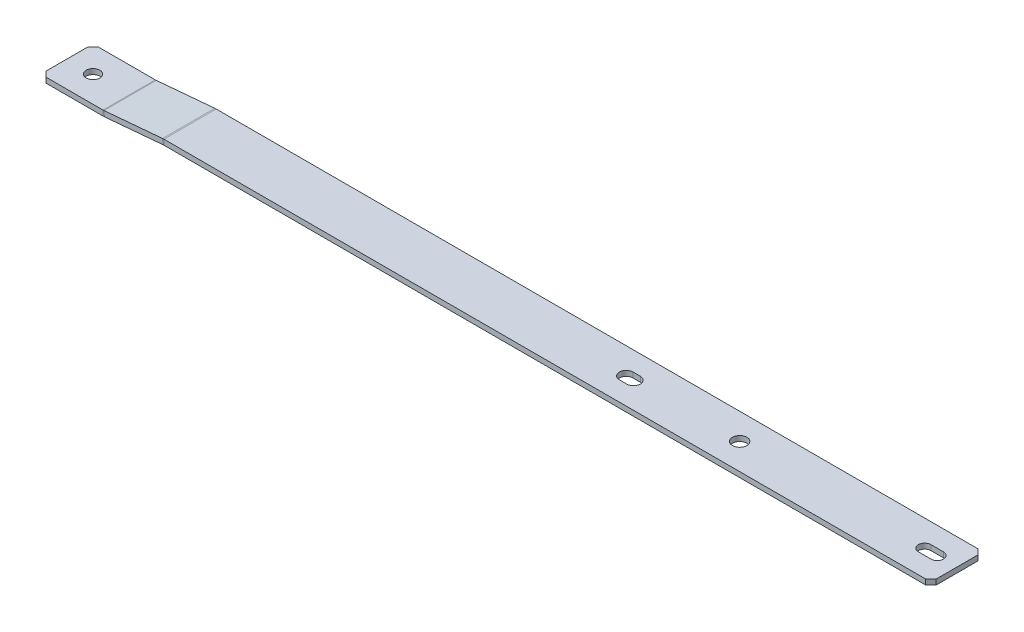
ISO-10303-21;
HEADER;
FILE_DESCRIPTION(('STEP AP214'),'2;1');
FILE_NAME('part.step','',(''),(''),'','','');
FILE_SCHEMA(('AUTOMOTIVE_DESIGN { 1 0 10303 214 1 1 1 1 }'));
ENDSEC;
DATA;
#1=APPLICATION_CONTEXT('core data for automotive mechanical design processes');
#2=APPLICATION_PROTOCOL_DEFINITION('international standard','automotive_design',2000,#1);
#3=PRODUCT_CONTEXT('',#1,'mechanical');
#4=PRODUCT('Part','Part','',(#3));
#5=PRODUCT_RELATED_PRODUCT_CATEGORY('part','',(#4));
#6=PRODUCT_DEFINITION_FORMATION('','',#4);
#7=PRODUCT_DEFINITION_CONTEXT('part definition',#1,'design');
#8=PRODUCT_DEFINITION('design','',#6,#7);
#9=PRODUCT_DEFINITION_SHAPE('','',#8);
#10=(LENGTH_UNIT() NAMED_UNIT(*) SI_UNIT(.MILLI.,.METRE.));
#11=(NAMED_UNIT(*) PLANE_ANGLE_UNIT() SI_UNIT($,.RADIAN.));
#12=(NAMED_UNIT(*) SI_UNIT($,.STERADIAN.) SOLID_ANGLE_UNIT());
#13=UNCERTAINTY_MEASURE_WITH_UNIT(LENGTH_MEASURE(1.E-05),#10,'distance_accuracy_value','');
#14=(GEOMETRIC_REPRESENTATION_CONTEXT(3) GLOBAL_UNCERTAINTY_ASSIGNED_CONTEXT((#13)) GLOBAL_UNIT_ASSIGNED_CONTEXT((#10,
#11,#12)) REPRESENTATION_CONTEXT('',''));
#15=CARTESIAN_POINT('',(0.,0.,0.));
#16=DIRECTION('',(0.,0.,1.));
#17=DIRECTION('',(1.,0.,0.));
#18=AXIS2_PLACEMENT_3D('',#15,#16,#17);
#19=CARTESIAN_POINT('',(-733.694824342566,0.,50.));
#20=DIRECTION('',(0.,0.,1.));
#21=DIRECTION('',(1.,0.,0.));
#22=AXIS2_PLACEMENT_3D('',#19,#20,#21);
#23=PLANE('',#22);
#24=DIRECTION('',(0.,-1.,0.));
#25=VECTOR('',#24,1.);
#26=CARTESIAN_POINT('',(-733.694824342566,0.,50.));
#27=LINE('',#26,#25);
#28=CARTESIAN_POINT('',(-733.694824342566,0.,50.));
#29=VERTEX_POINT('',#28);
#30=CARTESIAN_POINT('',(-733.694824342566,-5.,50.));
#31=VERTEX_POINT('',#30);
#32=EDGE_CURVE('E388',#29,#31,#27,.T.);
#33=ORIENTED_EDGE('',*,*,#32,.F.);
#34=CARTESIAN_POINT('',(-733.694824342566,-15.,50.));
#35=DIRECTION('',(0.,0.,-1.));
#36=DIRECTION('',(-1.,0.,0.));
#37=AXIS2_PLACEMENT_3D('',#34,#35,#36);
#38=CIRCLE('',#37,15.);
#39=CARTESIAN_POINT('',(-735.002160483781,-0.0570795286238173,50.));
#40=VERTEX_POINT('',#39);
#41=EDGE_CURVE('E292',#40,#29,#38,.T.);
#42=ORIENTED_EDGE('',*,*,#41,.F.);
#43=DIRECTION('',(-0.0871557427476687,0.996194698091745,0.));
#44=VECTOR('',#43,1.);
#45=CARTESIAN_POINT('',(-734.566381770042,-5.03805301908255,50.));
#46=LINE('',#45,#44);
#47=CARTESIAN_POINT('',(-734.566381770042,-5.03805301908255,50.));
#48=VERTEX_POINT('',#47);
#49=EDGE_CURVE('E386',#48,#40,#46,.T.);
#50=ORIENTED_EDGE('',*,*,#49,.F.);
#51=CARTESIAN_POINT('',(-733.694824342566,-15.,50.));
#52=DIRECTION('',(0.,0.,1.));
#53=DIRECTION('',(1.,0.,0.));
#54=AXIS2_PLACEMENT_3D('',#51,#52,#53);
#55=CIRCLE('',#54,10.);
#56=EDGE_CURVE('E311',#48,#31,#55,.F.);
#57=ORIENTED_EDGE('',*,*,#56,.T.);
#58=EDGE_LOOP('',(#33,#42,#50,#57));
#59=FACE_BOUND('',#58,.T.);
#60=ADVANCED_FACE('F45',(#59),#23,.T.);
#61=CARTESIAN_POINT('',(-734.566381770042,-5.03805301908255,50.));
#62=DIRECTION('',(0.,0.,1.));
#63=DIRECTION('',(1.,0.,0.));
#64=AXIS2_PLACEMENT_3D('',#61,#62,#63);
#65=PLANE('',#64);
#66=DIRECTION('',(1.,0.,0.));
#67=VECTOR('',#66,1.);
#68=CARTESIAN_POINT('',(-734.349738486193,-5.,50.));
#69=LINE('',#68,#67);
#70=CARTESIAN_POINT('',(-5.,-5.,50.));
#71=VERTEX_POINT('',#70);
#72=EDGE_CURVE('E285',#31,#71,#69,.T.);
#73=ORIENTED_EDGE('',*,*,#72,.T.);
#74=DIRECTION('',(0.,1.,0.));
#75=VECTOR('',#74,1.);
#76=CARTESIAN_POINT('',(-5.,-5.03805301908255,50.));
#77=LINE('',#76,#75);
#78=CARTESIAN_POINT('',(-5.,0.,50.));
#79=VERTEX_POINT('',#78);
#80=EDGE_CURVE('E408',#71,#79,#77,.T.);
#81=ORIENTED_EDGE('',*,*,#80,.T.);
#82=DIRECTION('',(1.,0.,0.));
#83=VECTOR('',#82,1.);
#84=CARTESIAN_POINT('',(-734.349738486193,0.,50.));
#85=LINE('',#84,#83);
#86=EDGE_CURVE('E288',#29,#79,#85,.T.);
#87=ORIENTED_EDGE('',*,*,#86,.F.);
#88=ORIENTED_EDGE('',*,*,#32,.T.);
#89=EDGE_LOOP('',(#73,#81,#87,#88));
#90=FACE_BOUND('',#89,.T.);
#91=ADVANCED_FACE('F508',(#90),#65,.T.);
#92=CARTESIAN_POINT('',(-735.002160483781,-0.0570795286238173,0.));
#93=DIRECTION('',(0.,0.,-1.));
#94=DIRECTION('',(-1.,0.,0.));
#95=AXIS2_PLACEMENT_3D('',#92,#93,#94);
#96=PLANE('',#95);
#97=DIRECTION('',(0.0871557427476687,-0.996194698091745,0.));
#98=VECTOR('',#97,1.);
#99=CARTESIAN_POINT('',(-735.002160483781,-0.0570795286238173,0.));
#100=LINE('',#99,#98);
#101=CARTESIAN_POINT('',(-735.002160483781,-0.0570795286238173,0.));
#102=VERTEX_POINT('',#101);
#103=CARTESIAN_POINT('',(-734.566381770042,-5.03805301908255,0.));
#104=VERTEX_POINT('',#103);
#105=EDGE_CURVE('E384',#102,#104,#100,.T.);
#106=ORIENTED_EDGE('',*,*,#105,.F.);
#107=CARTESIAN_POINT('',(-733.694824342566,-15.,0.));
#108=DIRECTION('',(0.,0.,-1.));
#109=DIRECTION('',(-1.,0.,0.));
#110=AXIS2_PLACEMENT_3D('',#107,#108,#109);
#111=CIRCLE('',#110,15.);
#112=CARTESIAN_POINT('',(-733.694824342566,0.,0.));
#113=VERTEX_POINT('',#112);
#114=EDGE_CURVE('E320',#102,#113,#111,.T.);
#115=ORIENTED_EDGE('',*,*,#114,.T.);
#116=DIRECTION('',(0.,1.,0.));
#117=VECTOR('',#116,1.);
#118=CARTESIAN_POINT('',(-733.694824342566,-5.,0.));
#119=LINE('',#118,#117);
#120=CARTESIAN_POINT('',(-733.694824342566,-5.,0.));
#121=VERTEX_POINT('',#120);
#122=EDGE_CURVE('E382',#121,#113,#119,.T.);
#123=ORIENTED_EDGE('',*,*,#122,.F.);
#124=CARTESIAN_POINT('',(-733.694824342566,-15.,0.));
#125=DIRECTION('',(0.,0.,1.));
#126=DIRECTION('',(1.,0.,0.));
#127=AXIS2_PLACEMENT_3D('',#124,#125,#126);
#128=CIRCLE('',#127,10.);
#129=EDGE_CURVE('E289',#104,#121,#128,.F.);
#130=ORIENTED_EDGE('',*,*,#129,.F.);
#131=EDGE_LOOP('',(#106,#115,#123,#130));
#132=FACE_BOUND('',#131,.T.);
#133=ADVANCED_FACE('F483',(#132),#96,.T.);
#134=CARTESIAN_POINT('',(-733.694824342566,-5.,0.));
#135=DIRECTION('',(0.,0.,-1.));
#136=DIRECTION('',(-1.,0.,0.));
#137=AXIS2_PLACEMENT_3D('',#134,#135,#136);
#138=PLANE('',#137);
#139=DIRECTION('',(0.996194698091746,0.0871557427476584,0.));
#140=VECTOR('',#139,1.);
#141=CARTESIAN_POINT('',(-734.349738486193,0.,0.));
#142=LINE('',#141,#140);
#143=CARTESIAN_POINT('',(-791.065052001608,-4.96194698091745,0.));
#144=VERTEX_POINT('',#143);
#145=EDGE_CURVE('E323',#144,#102,#142,.T.);
#146=ORIENTED_EDGE('',*,*,#145,.T.);
#147=ORIENTED_EDGE('',*,*,#105,.T.);
#148=DIRECTION('',(0.996194698091746,0.0871557427476584,0.));
#149=VECTOR('',#148,1.);
#150=CARTESIAN_POINT('',(-733.913959772455,-4.98097349045873,0.));
#151=LINE('',#150,#149);
#152=CARTESIAN_POINT('',(-790.62927328787,-9.94292047137618,0.));
#153=VERTEX_POINT('',#152);
#154=EDGE_CURVE('E336',#153,#104,#151,.T.);
#155=ORIENTED_EDGE('',*,*,#154,.F.);
#156=DIRECTION('',(-0.0871557427476687,0.996194698091745,0.));
#157=VECTOR('',#156,1.);
#158=CARTESIAN_POINT('',(-790.62927328787,-9.94292047137618,0.));
#159=LINE('',#158,#157);
#160=EDGE_CURVE('E372',#153,#144,#159,.T.);
#161=ORIENTED_EDGE('',*,*,#160,.T.);
#162=EDGE_LOOP('',(#146,#147,#155,#161));
#163=FACE_BOUND('',#162,.T.);
#164=ADVANCED_FACE('F465',(#163),#138,.T.);
#165=CARTESIAN_POINT('',(-791.065052001608,-4.96194698091745,50.));
#166=DIRECTION('',(0.,0.,1.));
#167=DIRECTION('',(1.,0.,0.));
#168=AXIS2_PLACEMENT_3D('',#165,#166,#167);
#169=PLANE('',#168);
#170=DIRECTION('',(0.0871557427476687,-0.996194698091745,0.));
#171=VECTOR('',#170,1.);
#172=CARTESIAN_POINT('',(-791.065052001608,-4.96194698091745,50.));
#173=LINE('',#172,#171);
#174=CARTESIAN_POINT('',(-791.065052001608,-4.96194698091745,50.));
#175=VERTEX_POINT('',#174);
#176=CARTESIAN_POINT('',(-790.62927328787,-9.94292047137618,50.));
#177=VERTEX_POINT('',#176);
#178=EDGE_CURVE('E380',#175,#177,#173,.T.);
#179=ORIENTED_EDGE('',*,*,#178,.F.);
#180=CARTESIAN_POINT('',(-791.936609429085,5.,50.));
#181=DIRECTION('',(0.,0.,1.));
#182=DIRECTION('',(1.,0.,0.));
#183=AXIS2_PLACEMENT_3D('',#180,#181,#182);
#184=CIRCLE('',#183,10.);
#185=CARTESIAN_POINT('',(-791.936609429085,-5.00000000000001,50.));
#186=VERTEX_POINT('',#185);
#187=EDGE_CURVE('E298',#186,#175,#184,.T.);
#188=ORIENTED_EDGE('',*,*,#187,.F.);
#189=DIRECTION('',(0.,1.,0.));
#190=VECTOR('',#189,1.);
#191=CARTESIAN_POINT('',(-791.936609429085,-10.,50.));
#192=LINE('',#191,#190);
#193=CARTESIAN_POINT('',(-791.936609429085,-10.,50.));
#194=VERTEX_POINT('',#193);
#195=EDGE_CURVE('E377',#194,#186,#192,.T.);
#196=ORIENTED_EDGE('',*,*,#195,.F.);
#197=CARTESIAN_POINT('',(-791.936609429085,5.,50.));
#198=DIRECTION('',(0.,0.,1.));
#199=DIRECTION('',(1.,0.,0.));
#200=AXIS2_PLACEMENT_3D('',#197,#198,#199);
#201=CIRCLE('',#200,15.);
#202=EDGE_CURVE('E305',#194,#177,#201,.T.);
#203=ORIENTED_EDGE('',*,*,#202,.T.);
#204=EDGE_LOOP('',(#179,#188,#196,#203));
#205=FACE_BOUND('',#204,.T.);
#206=ADVANCED_FACE('F498',(#205),#169,.T.);
#207=CARTESIAN_POINT('',(-791.936609429085,-10.,50.));
#208=DIRECTION('',(0.,0.,1.));
#209=DIRECTION('',(1.,0.,0.));
#210=AXIS2_PLACEMENT_3D('',#207,#208,#209);
#211=PLANE('',#210);
#212=DIRECTION('',(0.996194698091746,0.0871557427476584,0.));
#213=VECTOR('',#212,1.);
#214=CARTESIAN_POINT('',(-734.349738486193,0.,50.));
#215=LINE('',#214,#213);
#216=EDGE_CURVE('E295',#175,#40,#215,.T.);
#217=ORIENTED_EDGE('',*,*,#216,.F.);
#218=ORIENTED_EDGE('',*,*,#178,.T.);
#219=DIRECTION('',(0.996194698091746,0.0871557427476584,0.));
#220=VECTOR('',#219,1.);
#221=CARTESIAN_POINT('',(-733.913959772455,-4.98097349045873,50.));
#222=LINE('',#221,#220);
#223=EDGE_CURVE('E308',#177,#48,#222,.T.);
#224=ORIENTED_EDGE('',*,*,#223,.T.);
#225=ORIENTED_EDGE('',*,*,#49,.T.);
#226=EDGE_LOOP('',(#217,#218,#224,#225));
#227=FACE_BOUND('',#226,.T.);
#228=ADVANCED_FACE('F496',(#227),#211,.T.);
#229=CARTESIAN_POINT('',(-791.936609429085,-5.00000000000001,0.));
#230=DIRECTION('',(0.,0.,-1.));
#231=DIRECTION('',(-1.,0.,0.));
#232=AXIS2_PLACEMENT_3D('',#229,#230,#231);
#233=PLANE('',#232);
#234=DIRECTION('',(0.,-1.,0.));
#235=VECTOR('',#234,1.);
#236=CARTESIAN_POINT('',(-791.936609429085,-5.00000000000001,0.));
#237=LINE('',#236,#235);
#238=CARTESIAN_POINT('',(-791.936609429085,-5.00000000000001,0.));
#239=VERTEX_POINT('',#238);
#240=CARTESIAN_POINT('',(-791.936609429085,-10.,0.));
#241=VERTEX_POINT('',#240);
#242=EDGE_CURVE('E374',#239,#241,#237,.T.);
#243=ORIENTED_EDGE('',*,*,#242,.F.);
#244=CARTESIAN_POINT('',(-791.936609429085,5.,0.));
#245=DIRECTION('',(0.,0.,1.));
#246=DIRECTION('',(1.,0.,0.));
#247=AXIS2_PLACEMENT_3D('',#244,#245,#246);
#248=CIRCLE('',#247,10.);
#249=EDGE_CURVE('E326',#239,#144,#248,.T.);
#250=ORIENTED_EDGE('',*,*,#249,.T.);
#251=ORIENTED_EDGE('',*,*,#160,.F.);
#252=CARTESIAN_POINT('',(-791.936609429085,5.,0.));
#253=DIRECTION('',(0.,0.,1.));
#254=DIRECTION('',(1.,0.,0.));
#255=AXIS2_PLACEMENT_3D('',#252,#253,#254);
#256=CIRCLE('',#255,15.);
#257=EDGE_CURVE('E333',#241,#153,#256,.T.);
#258=ORIENTED_EDGE('',*,*,#257,.F.);
#259=EDGE_LOOP('',(#243,#250,#251,#258));
#260=FACE_BOUND('',#259,.T.);
#261=ADVANCED_FACE('F461',(#260),#233,.T.);
#262=CARTESIAN_POINT('',(-790.62927328787,-9.94292047137618,0.));
#263=DIRECTION('',(0.,0.,-1.));
#264=DIRECTION('',(-1.,0.,0.));
#265=AXIS2_PLACEMENT_3D('',#262,#263,#264);
#266=PLANE('',#265);
#267=DIRECTION('',(1.,0.,0.));
#268=VECTOR('',#267,1.);
#269=CARTESIAN_POINT('',(-791.5,-10.,0.));
#270=LINE('',#269,#268);
#271=CARTESIAN_POINT('',(-846.5,-10.,0.));
#272=VERTEX_POINT('',#271);
#273=EDGE_CURVE('E331',#272,#241,#270,.T.);
#274=ORIENTED_EDGE('',*,*,#273,.F.);
#275=DIRECTION('',(0.,1.,0.));
#276=VECTOR('',#275,1.);
#277=CARTESIAN_POINT('',(-846.5,-9.94292047137618,0.));
#278=LINE('',#277,#276);
#279=CARTESIAN_POINT('',(-846.5,-5.00000000000001,0.));
#280=VERTEX_POINT('',#279);
#281=EDGE_CURVE('E412',#272,#280,#278,.T.);
#282=ORIENTED_EDGE('',*,*,#281,.T.);
#283=DIRECTION('',(1.,0.,0.));
#284=VECTOR('',#283,1.);
#285=CARTESIAN_POINT('',(-791.5,-5.00000000000001,0.));
#286=LINE('',#285,#284);
#287=EDGE_CURVE('E329',#280,#239,#286,.T.);
#288=ORIENTED_EDGE('',*,*,#287,.T.);
#289=ORIENTED_EDGE('',*,*,#242,.T.);
#290=EDGE_LOOP('',(#274,#282,#288,#289));
#291=FACE_BOUND('',#290,.T.);
#292=ADVANCED_FACE('F454',(#291),#266,.T.);
#293=CARTESIAN_POINT('',(-734.349738486193,-5.,50.));
#294=DIRECTION('',(0.,1.,0.));
#295=DIRECTION('',(0.,0.,1.));
#296=AXIS2_PLACEMENT_3D('',#293,#294,#295);
#297=PLANE('',#296);
#298=DIRECTION('',(1.,0.,0.));
#299=VECTOR('',#298,1.);
#300=CARTESIAN_POINT('',(-734.349738486193,-5.,30.9999999999995));
#301=LINE('',#300,#299);
#302=CARTESIAN_POINT('',(-31.,-5.,30.9999999999999));
#303=VERTEX_POINT('',#302);
#304=CARTESIAN_POINT('',(-19.,-5.,30.9999999999999));
#305=VERTEX_POINT('',#304);
#306=EDGE_CURVE('E236',#303,#305,#301,.T.);
#307=ORIENTED_EDGE('',*,*,#306,.T.);
#308=CARTESIAN_POINT('',(-19.,-5.,24.9999999999999));
#309=DIRECTION('',(0.,1.,0.));
#310=DIRECTION('',(0.,0.,1.));
#311=AXIS2_PLACEMENT_3D('',#308,#309,#310);
#312=CIRCLE('',#311,6.00000000000001);
#313=CARTESIAN_POINT('',(-19.,-5.,18.9999999999999));
#314=VERTEX_POINT('',#313);
#315=EDGE_CURVE('E239',#305,#314,#312,.T.);
#316=ORIENTED_EDGE('',*,*,#315,.T.);
#317=DIRECTION('',(-1.,0.,0.));
#318=VECTOR('',#317,1.);
#319=CARTESIAN_POINT('',(-734.349738486193,-5.,18.9999999999999));
#320=LINE('',#319,#318);
#321=CARTESIAN_POINT('',(-30.9999999999999,-5.,18.9999999999999));
#322=VERTEX_POINT('',#321);
#323=EDGE_CURVE('E231',#314,#322,#320,.T.);
#324=ORIENTED_EDGE('',*,*,#323,.T.);
#325=CARTESIAN_POINT('',(-31.,-5.,24.9999999999999));
#326=DIRECTION('',(0.,1.,0.));
#327=DIRECTION('',(0.,0.,1.));
#328=AXIS2_PLACEMENT_3D('',#325,#326,#327);
#329=CIRCLE('',#328,6.);
#330=EDGE_CURVE('E211',#322,#303,#329,.T.);
#331=ORIENTED_EDGE('',*,*,#330,.T.);
#332=EDGE_LOOP('',(#307,#316,#324,#331));
#333=FACE_BOUND('',#332,.T.);
#334=CARTESIAN_POINT('',(-208.,-5.,25.));
#335=DIRECTION('',(0.,1.,0.));
#336=DIRECTION('',(0.,0.,1.));
#337=AXIS2_PLACEMENT_3D('',#334,#335,#336);
#338=CIRCLE('',#337,6.89999999999999);
#339=CARTESIAN_POINT('',(-208.,-5.,31.9));
#340=VERTEX_POINT('',#339);
#341=EDGE_CURVE('E281',#340,#340,#338,.T.);
#342=ORIENTED_EDGE('',*,*,#341,.T.);
#343=EDGE_LOOP('',(#342));
#344=FACE_BOUND('',#343,.T.);
#345=DIRECTION('',(1.,0.,0.));
#346=VECTOR('',#345,1.);
#347=CARTESIAN_POINT('',(-734.349738486193,-5.,31.5));
#348=LINE('',#347,#346);
#349=CARTESIAN_POINT('',(-316.5,-5.,31.5));
#350=VERTEX_POINT('',#349);
#351=CARTESIAN_POINT('',(-309.5,-5.,31.5));
#352=VERTEX_POINT('',#351);
#353=EDGE_CURVE('E275',#350,#352,#348,.T.);
#354=ORIENTED_EDGE('',*,*,#353,.T.);
#355=CARTESIAN_POINT('',(-309.5,-5.,25.));
#356=DIRECTION('',(0.,1.,0.));
#357=DIRECTION('',(0.,0.,1.));
#358=AXIS2_PLACEMENT_3D('',#355,#356,#357);
#359=CIRCLE('',#358,6.5);
#360=CARTESIAN_POINT('',(-309.5,-5.,18.5));
#361=VERTEX_POINT('',#360);
#362=EDGE_CURVE('E278',#352,#361,#359,.T.);
#363=ORIENTED_EDGE('',*,*,#362,.T.);
#364=DIRECTION('',(-1.,0.,0.));
#365=VECTOR('',#364,1.);
#366=CARTESIAN_POINT('',(-734.349738486193,-5.,18.5000000000002));
#367=LINE('',#366,#365);
#368=CARTESIAN_POINT('',(-316.5,-5.,18.5));
#369=VERTEX_POINT('',#368);
#370=EDGE_CURVE('E249',#361,#369,#367,.T.);
#371=ORIENTED_EDGE('',*,*,#370,.T.);
#372=CARTESIAN_POINT('',(-316.5,-5.,25.));
#373=DIRECTION('',(0.,1.,0.));
#374=DIRECTION('',(0.,0.,1.));
#375=AXIS2_PLACEMENT_3D('',#372,#373,#374);
#376=CIRCLE('',#375,6.5);
#377=EDGE_CURVE('E272',#369,#350,#376,.T.);
#378=ORIENTED_EDGE('',*,*,#377,.T.);
#379=EDGE_LOOP('',(#354,#363,#371,#378));
#380=FACE_BOUND('',#379,.T.);
#381=DIRECTION('',(0.,0.,-1.));
#382=VECTOR('',#381,1.);
#383=CARTESIAN_POINT('',(0.,-5.,50.));
#384=LINE('',#383,#382);
#385=CARTESIAN_POINT('',(0.,-5.,45.));
#386=VERTEX_POINT('',#385);
#387=CARTESIAN_POINT('',(0.,-5.,5.));
#388=VERTEX_POINT('',#387);
#389=EDGE_CURVE('E370',#386,#388,#384,.T.);
#390=ORIENTED_EDGE('',*,*,#389,.F.);
#391=DIRECTION('',(0.707106781186548,0.,-0.707106781186547));
#392=VECTOR('',#391,1.);
#393=CARTESIAN_POINT('',(0.,-5.,45.));
#394=LINE('',#393,#392);
#395=EDGE_CURVE('E406',#386,#71,#394,.F.);
#396=ORIENTED_EDGE('',*,*,#395,.T.);
#397=ORIENTED_EDGE('',*,*,#72,.F.);
#398=DIRECTION('',(0.,0.,-1.));
#399=VECTOR('',#398,1.);
#400=CARTESIAN_POINT('',(-733.694824342566,-5.,50.));
#401=LINE('',#400,#399);
#402=EDGE_CURVE('E314',#31,#121,#401,.T.);
#403=ORIENTED_EDGE('',*,*,#402,.T.);
#404=DIRECTION('',(1.,0.,0.));
#405=VECTOR('',#404,1.);
#406=CARTESIAN_POINT('',(-734.349738486193,-5.,0.));
#407=LINE('',#406,#405);
#408=CARTESIAN_POINT('',(-5.,-5.,0.));
#409=VERTEX_POINT('',#408);
#410=EDGE_CURVE('E284',#121,#409,#407,.T.);
#411=ORIENTED_EDGE('',*,*,#410,.T.);
#412=DIRECTION('',(-0.707106781186548,0.,-0.707106781186547));
#413=VECTOR('',#412,1.);
#414=CARTESIAN_POINT('',(-5.,-5.,0.));
#415=LINE('',#414,#413);
#416=EDGE_CURVE('E395',#409,#388,#415,.F.);
#417=ORIENTED_EDGE('',*,*,#416,.T.);
#418=EDGE_LOOP('',(#390,#396,#397,#403,#411,#417));
#419=FACE_BOUND('',#418,.T.);
#420=ADVANCED_FACE('F597',(#333,#344,#380,#419),#297,.F.);
#421=CARTESIAN_POINT('',(0.,0.,50.));
#422=DIRECTION('',(1.,0.,0.));
#423=DIRECTION('',(0.,0.,-1.));
#424=AXIS2_PLACEMENT_3D('',#421,#422,#423);
#425=PLANE('',#424);
#426=DIRECTION('',(0.,0.,-1.));
#427=VECTOR('',#426,1.);
#428=CARTESIAN_POINT('',(0.,0.,50.));
#429=LINE('',#428,#427);
#430=CARTESIAN_POINT('',(0.,0.,45.));
#431=VERTEX_POINT('',#430);
#432=CARTESIAN_POINT('',(0.,0.,5.));
#433=VERTEX_POINT('',#432);
#434=EDGE_CURVE('E368',#431,#433,#429,.T.);
#435=ORIENTED_EDGE('',*,*,#434,.F.);
#436=DIRECTION('',(0.,-1.,0.));
#437=VECTOR('',#436,1.);
#438=CARTESIAN_POINT('',(0.,0.,45.));
#439=LINE('',#438,#437);
#440=EDGE_CURVE('E403',#431,#386,#439,.T.);
#441=ORIENTED_EDGE('',*,*,#440,.T.);
#442=ORIENTED_EDGE('',*,*,#389,.T.);
#443=DIRECTION('',(0.,1.,0.));
#444=VECTOR('',#443,1.);
#445=CARTESIAN_POINT('',(0.,0.,5.));
#446=LINE('',#445,#444);
#447=EDGE_CURVE('E398',#388,#433,#446,.T.);
#448=ORIENTED_EDGE('',*,*,#447,.T.);
#449=EDGE_LOOP('',(#435,#441,#442,#448));
#450=FACE_BOUND('',#449,.T.);
#451=ADVANCED_FACE('F594',(#450),#425,.T.);
#452=CARTESIAN_POINT('',(-734.349738486193,0.,50.));
#453=DIRECTION('',(0.,1.,0.));
#454=DIRECTION('',(0.,0.,1.));
#455=AXIS2_PLACEMENT_3D('',#452,#453,#454);
#456=PLANE('',#455);
#457=CARTESIAN_POINT('',(-19.,0.,24.9999999999999));
#458=DIRECTION('',(0.,1.,0.));
#459=DIRECTION('',(0.,0.,1.));
#460=AXIS2_PLACEMENT_3D('',#457,#458,#459);
#461=CIRCLE('',#460,6.00000000000001);
#462=CARTESIAN_POINT('',(-19.,0.,30.9999999999999));
#463=VERTEX_POINT('',#462);
#464=CARTESIAN_POINT('',(-19.,0.,18.9999999999999));
#465=VERTEX_POINT('',#464);
#466=EDGE_CURVE('E68',#463,#465,#461,.T.);
#467=ORIENTED_EDGE('',*,*,#466,.F.);
#468=DIRECTION('',(1.,0.,0.));
#469=VECTOR('',#468,1.);
#470=CARTESIAN_POINT('',(-19.,0.,30.9999999999999));
#471=LINE('',#470,#469);
#472=CARTESIAN_POINT('',(-31.,0.,30.9999999999999));
#473=VERTEX_POINT('',#472);
#474=EDGE_CURVE('E224',#473,#463,#471,.T.);
#475=ORIENTED_EDGE('',*,*,#474,.F.);
#476=CARTESIAN_POINT('',(-31.,0.,24.9999999999999));
#477=DIRECTION('',(0.,1.,0.));
#478=DIRECTION('',(0.,0.,1.));
#479=AXIS2_PLACEMENT_3D('',#476,#477,#478);
#480=CIRCLE('',#479,6.);
#481=CARTESIAN_POINT('',(-31.,0.,18.9999999999999));
#482=VERTEX_POINT('',#481);
#483=EDGE_CURVE('E208',#482,#473,#480,.T.);
#484=ORIENTED_EDGE('',*,*,#483,.F.);
#485=DIRECTION('',(-1.,0.,0.));
#486=VECTOR('',#485,1.);
#487=CARTESIAN_POINT('',(-19.,0.,18.9999999999999));
#488=LINE('',#487,#486);
#489=EDGE_CURVE('E217',#465,#482,#488,.T.);
#490=ORIENTED_EDGE('',*,*,#489,.F.);
#491=EDGE_LOOP('',(#467,#475,#484,#490));
#492=FACE_BOUND('',#491,.T.);
#493=CARTESIAN_POINT('',(-208.,0.,25.));
#494=DIRECTION('',(0.,1.,0.));
#495=DIRECTION('',(0.,0.,1.));
#496=AXIS2_PLACEMENT_3D('',#493,#494,#495);
#497=CIRCLE('',#496,6.89999999999999);
#498=CARTESIAN_POINT('',(-208.,0.,31.9));
#499=VERTEX_POINT('',#498);
#500=EDGE_CURVE('E246',#499,#499,#497,.T.);
#501=ORIENTED_EDGE('',*,*,#500,.F.);
#502=EDGE_LOOP('',(#501));
#503=FACE_BOUND('',#502,.T.);
#504=CARTESIAN_POINT('',(-309.5,0.,25.));
#505=DIRECTION('',(0.,1.,0.));
#506=DIRECTION('',(0.,0.,1.));
#507=AXIS2_PLACEMENT_3D('',#504,#505,#506);
#508=CIRCLE('',#507,6.5);
#509=CARTESIAN_POINT('',(-309.5,0.,31.5));
#510=VERTEX_POINT('',#509);
#511=CARTESIAN_POINT('',(-309.5,0.,18.5));
#512=VERTEX_POINT('',#511);
#513=EDGE_CURVE('E251',#510,#512,#508,.T.);
#514=ORIENTED_EDGE('',*,*,#513,.F.);
#515=DIRECTION('',(1.,0.,0.));
#516=VECTOR('',#515,1.);
#517=CARTESIAN_POINT('',(-309.5,0.,31.5));
#518=LINE('',#517,#516);
#519=CARTESIAN_POINT('',(-316.5,0.,31.5));
#520=VERTEX_POINT('',#519);
#521=EDGE_CURVE('E259',#520,#510,#518,.T.);
#522=ORIENTED_EDGE('',*,*,#521,.F.);
#523=CARTESIAN_POINT('',(-316.5,0.,25.));
#524=DIRECTION('',(0.,1.,0.));
#525=DIRECTION('',(0.,0.,1.));
#526=AXIS2_PLACEMENT_3D('',#523,#524,#525);
#527=CIRCLE('',#526,6.5);
#528=CARTESIAN_POINT('',(-316.5,0.,18.5));
#529=VERTEX_POINT('',#528);
#530=EDGE_CURVE('E256',#529,#520,#527,.T.);
#531=ORIENTED_EDGE('',*,*,#530,.F.);
#532=DIRECTION('',(-1.,0.,0.));
#533=VECTOR('',#532,1.);
#534=CARTESIAN_POINT('',(-309.5,0.,18.5));
#535=LINE('',#534,#533);
#536=EDGE_CURVE('E253',#512,#529,#535,.T.);
#537=ORIENTED_EDGE('',*,*,#536,.F.);
#538=EDGE_LOOP('',(#514,#522,#531,#537));
#539=FACE_BOUND('',#538,.T.);
#540=ORIENTED_EDGE('',*,*,#86,.T.);
#541=DIRECTION('',(-0.707106781186548,0.,0.707106781186547));
#542=VECTOR('',#541,1.);
#543=CARTESIAN_POINT('',(-369.674869243097,0.,414.674869243097));
#544=LINE('',#543,#542);
#545=EDGE_CURVE('E410',#79,#431,#544,.F.);
#546=ORIENTED_EDGE('',*,*,#545,.T.);
#547=ORIENTED_EDGE('',*,*,#434,.T.);
#548=DIRECTION('',(0.707106781186548,0.,0.707106781186547));
#549=VECTOR('',#548,1.);
#550=CARTESIAN_POINT('',(-344.674869243097,0.,-339.674869243097));
#551=LINE('',#550,#549);
#552=CARTESIAN_POINT('',(-5.,0.,0.));
#553=VERTEX_POINT('',#552);
#554=EDGE_CURVE('E401',#433,#553,#551,.F.);
#555=ORIENTED_EDGE('',*,*,#554,.T.);
#556=DIRECTION('',(1.,0.,0.));
#557=VECTOR('',#556,1.);
#558=CARTESIAN_POINT('',(-734.349738486193,0.,0.));
#559=LINE('',#558,#557);
#560=EDGE_CURVE('E317',#113,#553,#559,.T.);
#561=ORIENTED_EDGE('',*,*,#560,.F.);
#562=DIRECTION('',(0.,0.,-1.));
#563=VECTOR('',#562,1.);
#564=CARTESIAN_POINT('',(-733.694824342566,0.,50.));
#565=LINE('',#564,#563);
#566=EDGE_CURVE('E365',#29,#113,#565,.T.);
#567=ORIENTED_EDGE('',*,*,#566,.F.);
#568=EDGE_LOOP('',(#540,#546,#547,#555,#561,#567));
#569=FACE_BOUND('',#568,.T.);
#570=ADVANCED_FACE('F221',(#492,#503,#539,#569),#456,.T.);
#571=CARTESIAN_POINT('',(-733.694824342566,-15.,50.));
#572=DIRECTION('',(0.,0.,-1.));
#573=DIRECTION('',(-1.,0.,0.));
#574=AXIS2_PLACEMENT_3D('',#571,#572,#573);
#575=CYLINDRICAL_SURFACE('',#574,15.);
#576=ORIENTED_EDGE('',*,*,#114,.F.);
#577=DIRECTION('',(0.,0.,-1.));
#578=VECTOR('',#577,1.);
#579=CARTESIAN_POINT('',(-735.002160483781,-0.0570795286238173,50.));
#580=LINE('',#579,#578);
#581=EDGE_CURVE('E362',#40,#102,#580,.T.);
#582=ORIENTED_EDGE('',*,*,#581,.F.);
#583=ORIENTED_EDGE('',*,*,#41,.T.);
#584=ORIENTED_EDGE('',*,*,#566,.T.);
#585=EDGE_LOOP('',(#576,#582,#583,#584));
#586=FACE_BOUND('',#585,.T.);
#587=ADVANCED_FACE('F479',(#586),#575,.T.);
#588=CARTESIAN_POINT('',(-734.349738486193,0.,50.));
#589=DIRECTION('',(-0.0871557427476584,0.996194698091746,0.));
#590=DIRECTION('',(-0.996194698091746,-0.0871557427476584,0.));
#591=AXIS2_PLACEMENT_3D('',#588,#589,#590);
#592=PLANE('',#591);
#593=ORIENTED_EDGE('',*,*,#145,.F.);
#594=DIRECTION('',(0.,0.,-1.));
#595=VECTOR('',#594,1.);
#596=CARTESIAN_POINT('',(-791.065052001608,-4.96194698091745,50.));
#597=LINE('',#596,#595);
#598=EDGE_CURVE('E359',#175,#144,#597,.T.);
#599=ORIENTED_EDGE('',*,*,#598,.F.);
#600=ORIENTED_EDGE('',*,*,#216,.T.);
#601=ORIENTED_EDGE('',*,*,#581,.T.);
#602=EDGE_LOOP('',(#593,#599,#600,#601));
#603=FACE_BOUND('',#602,.T.);
#604=ADVANCED_FACE('F474',(#603),#592,.T.);
#605=CARTESIAN_POINT('',(-791.936609429085,5.,50.));
#606=DIRECTION('',(0.,0.,-1.));
#607=DIRECTION('',(-1.,0.,0.));
#608=AXIS2_PLACEMENT_3D('',#605,#606,#607);
#609=CYLINDRICAL_SURFACE('',#608,10.);
#610=ORIENTED_EDGE('',*,*,#249,.F.);
#611=DIRECTION('',(0.,0.,-1.));
#612=VECTOR('',#611,1.);
#613=CARTESIAN_POINT('',(-791.936609429085,-5.00000000000001,50.));
#614=LINE('',#613,#612);
#615=EDGE_CURVE('E356',#186,#239,#614,.T.);
#616=ORIENTED_EDGE('',*,*,#615,.F.);
#617=ORIENTED_EDGE('',*,*,#187,.T.);
#618=ORIENTED_EDGE('',*,*,#598,.T.);
#619=EDGE_LOOP('',(#610,#616,#617,#618));
#620=FACE_BOUND('',#619,.T.);
#621=ADVANCED_FACE('F469',(#620),#609,.F.);
#622=CARTESIAN_POINT('',(-791.5,-5.00000000000001,50.));
#623=DIRECTION('',(0.,1.,0.));
#624=DIRECTION('',(-1.,0.,0.));
#625=AXIS2_PLACEMENT_3D('',#622,#623,#624);
#626=PLANE('',#625);
#627=CARTESIAN_POINT('',(-826.5,-5.00000000000004,25.));
#628=DIRECTION('',(0.,1.,0.));
#629=DIRECTION('',(-1.,0.,0.));
#630=AXIS2_PLACEMENT_3D('',#627,#628,#629);
#631=CIRCLE('',#630,6.50000000000002);
#632=CARTESIAN_POINT('',(-833.,-5.00000000000004,25.));
#633=VERTEX_POINT('',#632);
#634=EDGE_CURVE('E242',#633,#633,#631,.T.);
#635=ORIENTED_EDGE('',*,*,#634,.F.);
#636=EDGE_LOOP('',(#635));
#637=FACE_BOUND('',#636,.T.);
#638=DIRECTION('',(0.,0.,-1.));
#639=VECTOR('',#638,1.);
#640=CARTESIAN_POINT('',(-851.5,-5.00000000000002,50.));
#641=LINE('',#640,#639);
#642=CARTESIAN_POINT('',(-851.5,-5.00000000000002,45.));
#643=VERTEX_POINT('',#642);
#644=CARTESIAN_POINT('',(-851.5,-5.00000000000002,5.));
#645=VERTEX_POINT('',#644);
#646=EDGE_CURVE('E354',#643,#645,#641,.T.);
#647=ORIENTED_EDGE('',*,*,#646,.F.);
#648=DIRECTION('',(0.707106781186548,0.,0.707106781186547));
#649=VECTOR('',#648,1.);
#650=CARTESIAN_POINT('',(-819.,-5.00000000000001,77.5));
#651=LINE('',#650,#649);
#652=CARTESIAN_POINT('',(-846.5,-5.00000000000001,50.));
#653=VERTEX_POINT('',#652);
#654=EDGE_CURVE('E426',#643,#653,#651,.T.);
#655=ORIENTED_EDGE('',*,*,#654,.T.);
#656=DIRECTION('',(1.,0.,0.));
#657=VECTOR('',#656,1.);
#658=CARTESIAN_POINT('',(-791.5,-5.00000000000001,50.));
#659=LINE('',#658,#657);
#660=EDGE_CURVE('E301',#653,#186,#659,.T.);
#661=ORIENTED_EDGE('',*,*,#660,.T.);
#662=ORIENTED_EDGE('',*,*,#615,.T.);
#663=ORIENTED_EDGE('',*,*,#287,.F.);
#664=DIRECTION('',(0.707106781186548,0.,-0.707106781186547));
#665=VECTOR('',#664,1.);
#666=CARTESIAN_POINT('',(-844.,-5.00000000000001,-2.5));
#667=LINE('',#666,#665);
#668=EDGE_CURVE('E415',#280,#645,#667,.F.);
#669=ORIENTED_EDGE('',*,*,#668,.T.);
#670=EDGE_LOOP('',(#647,#655,#661,#662,#663,#669));
#671=FACE_BOUND('',#670,.T.);
#672=ADVANCED_FACE('F445',(#637,#671),#626,.T.);
#673=CARTESIAN_POINT('',(-851.5,-10.,50.));
#674=DIRECTION('',(-1.,0.,0.));
#675=DIRECTION('',(0.,0.,1.));
#676=AXIS2_PLACEMENT_3D('',#673,#674,#675);
#677=PLANE('',#676);
#678=DIRECTION('',(0.,0.,-1.));
#679=VECTOR('',#678,1.);
#680=CARTESIAN_POINT('',(-851.5,-10.,50.));
#681=LINE('',#680,#679);
#682=CARTESIAN_POINT('',(-851.5,-10.,45.));
#683=VERTEX_POINT('',#682);
#684=CARTESIAN_POINT('',(-851.5,-10.,5.));
#685=VERTEX_POINT('',#684);
#686=EDGE_CURVE('E352',#683,#685,#681,.T.);
#687=ORIENTED_EDGE('',*,*,#686,.F.);
#688=DIRECTION('',(0.,1.,0.));
#689=VECTOR('',#688,1.);
#690=CARTESIAN_POINT('',(-851.5,-5.00000000000002,45.));
#691=LINE('',#690,#689);
#692=EDGE_CURVE('E423',#683,#643,#691,.T.);
#693=ORIENTED_EDGE('',*,*,#692,.T.);
#694=ORIENTED_EDGE('',*,*,#646,.T.);
#695=DIRECTION('',(0.,-1.,0.));
#696=VECTOR('',#695,1.);
#697=CARTESIAN_POINT('',(-851.5,-10.,5.));
#698=LINE('',#697,#696);
#699=EDGE_CURVE('E418',#645,#685,#698,.T.);
#700=ORIENTED_EDGE('',*,*,#699,.T.);
#701=EDGE_LOOP('',(#687,#693,#694,#700));
#702=FACE_BOUND('',#701,.T.);
#703=ADVANCED_FACE('F443',(#702),#677,.T.);
#704=CARTESIAN_POINT('',(-791.5,-10.,50.));
#705=DIRECTION('',(0.,1.,0.));
#706=DIRECTION('',(-1.,0.,0.));
#707=AXIS2_PLACEMENT_3D('',#704,#705,#706);
#708=PLANE('',#707);
#709=CARTESIAN_POINT('',(-826.5,-10.,25.));
#710=DIRECTION('',(0.,1.,0.));
#711=DIRECTION('',(-1.,0.,0.));
#712=AXIS2_PLACEMENT_3D('',#709,#710,#711);
#713=CIRCLE('',#712,6.50000000000002);
#714=CARTESIAN_POINT('',(-833.,-10.,25.));
#715=VERTEX_POINT('',#714);
#716=EDGE_CURVE('E245',#715,#715,#713,.T.);
#717=ORIENTED_EDGE('',*,*,#716,.T.);
#718=EDGE_LOOP('',(#717));
#719=FACE_BOUND('',#718,.T.);
#720=DIRECTION('',(1.,0.,0.));
#721=VECTOR('',#720,1.);
#722=CARTESIAN_POINT('',(-791.5,-10.,50.));
#723=LINE('',#722,#721);
#724=CARTESIAN_POINT('',(-846.5,-10.,50.));
#725=VERTEX_POINT('',#724);
#726=EDGE_CURVE('E303',#725,#194,#723,.T.);
#727=ORIENTED_EDGE('',*,*,#726,.F.);
#728=DIRECTION('',(-0.707106781186548,0.,-0.707106781186547));
#729=VECTOR('',#728,1.);
#730=CARTESIAN_POINT('',(-851.5,-10.,45.));
#731=LINE('',#730,#729);
#732=EDGE_CURVE('E11',#725,#683,#731,.T.);
#733=ORIENTED_EDGE('',*,*,#732,.T.);
#734=ORIENTED_EDGE('',*,*,#686,.T.);
#735=DIRECTION('',(-0.707106781186548,0.,0.707106781186547));
#736=VECTOR('',#735,1.);
#737=CARTESIAN_POINT('',(-846.5,-10.,0.));
#738=LINE('',#737,#736);
#739=EDGE_CURVE('E421',#685,#272,#738,.F.);
#740=ORIENTED_EDGE('',*,*,#739,.T.);
#741=ORIENTED_EDGE('',*,*,#273,.T.);
#742=DIRECTION('',(0.,0.,-1.));
#743=VECTOR('',#742,1.);
#744=CARTESIAN_POINT('',(-791.936609429085,-10.,50.));
#745=LINE('',#744,#743);
#746=EDGE_CURVE('E349',#194,#241,#745,.T.);
#747=ORIENTED_EDGE('',*,*,#746,.F.);
#748=EDGE_LOOP('',(#727,#733,#734,#740,#741,#747));
#749=FACE_BOUND('',#748,.T.);
#750=ADVANCED_FACE('F437',(#719,#749),#708,.F.);
#751=CARTESIAN_POINT('',(-791.936609429085,5.,50.));
#752=DIRECTION('',(0.,0.,-1.));
#753=DIRECTION('',(-1.,0.,0.));
#754=AXIS2_PLACEMENT_3D('',#751,#752,#753);
#755=CYLINDRICAL_SURFACE('',#754,15.);
#756=ORIENTED_EDGE('',*,*,#257,.T.);
#757=DIRECTION('',(0.,0.,-1.));
#758=VECTOR('',#757,1.);
#759=CARTESIAN_POINT('',(-790.62927328787,-9.94292047137618,50.));
#760=LINE('',#759,#758);
#761=EDGE_CURVE('E346',#177,#153,#760,.T.);
#762=ORIENTED_EDGE('',*,*,#761,.F.);
#763=ORIENTED_EDGE('',*,*,#202,.F.);
#764=ORIENTED_EDGE('',*,*,#746,.T.);
#765=EDGE_LOOP('',(#756,#762,#763,#764));
#766=FACE_BOUND('',#765,.T.);
#767=ADVANCED_FACE('F459',(#766),#755,.T.);
#768=CARTESIAN_POINT('',(-733.913959772455,-4.98097349045873,50.));
#769=DIRECTION('',(-0.0871557427476584,0.996194698091746,0.));
#770=DIRECTION('',(-0.996194698091746,-0.0871557427476584,0.));
#771=AXIS2_PLACEMENT_3D('',#768,#769,#770);
#772=PLANE('',#771);
#773=ORIENTED_EDGE('',*,*,#154,.T.);
#774=DIRECTION('',(0.,0.,-1.));
#775=VECTOR('',#774,1.);
#776=CARTESIAN_POINT('',(-734.566381770042,-5.03805301908255,50.));
#777=LINE('',#776,#775);
#778=EDGE_CURVE('E343',#48,#104,#777,.T.);
#779=ORIENTED_EDGE('',*,*,#778,.F.);
#780=ORIENTED_EDGE('',*,*,#223,.F.);
#781=ORIENTED_EDGE('',*,*,#761,.T.);
#782=EDGE_LOOP('',(#773,#779,#780,#781));
#783=FACE_BOUND('',#782,.T.);
#784=ADVANCED_FACE('F487',(#783),#772,.F.);
#785=CARTESIAN_POINT('',(-733.694824342566,-15.,50.));
#786=DIRECTION('',(0.,0.,-1.));
#787=DIRECTION('',(-1.,0.,0.));
#788=AXIS2_PLACEMENT_3D('',#785,#786,#787);
#789=CYLINDRICAL_SURFACE('',#788,10.);
#790=ORIENTED_EDGE('',*,*,#129,.T.);
#791=ORIENTED_EDGE('',*,*,#402,.F.);
#792=ORIENTED_EDGE('',*,*,#56,.F.);
#793=ORIENTED_EDGE('',*,*,#778,.T.);
#794=EDGE_LOOP('',(#790,#791,#792,#793));
#795=FACE_BOUND('',#794,.T.);
#796=ADVANCED_FACE('F491',(#795),#789,.F.);
#797=CARTESIAN_POINT('',(-733.694824342566,-15.,50.));
#798=DIRECTION('',(0.,0.,-1.));
#799=DIRECTION('',(-1.,0.,0.));
#800=AXIS2_PLACEMENT_3D('',#797,#798,#799);
#801=PLANE('',#800);
#802=ORIENTED_EDGE('',*,*,#660,.F.);
#803=DIRECTION('',(0.,-1.,0.));
#804=VECTOR('',#803,1.);
#805=CARTESIAN_POINT('',(-846.5,-10.,50.));
#806=LINE('',#805,#804);
#807=EDGE_CURVE('E53',#653,#725,#806,.T.);
#808=ORIENTED_EDGE('',*,*,#807,.T.);
#809=ORIENTED_EDGE('',*,*,#726,.T.);
#810=ORIENTED_EDGE('',*,*,#195,.T.);
#811=EDGE_LOOP('',(#802,#808,#809,#810));
#812=FACE_BOUND('',#811,.T.);
#813=ADVANCED_FACE('F431',(#812),#801,.F.);
#814=CARTESIAN_POINT('',(-733.694824342566,-15.,0.));
#815=DIRECTION('',(0.,0.,-1.));
#816=DIRECTION('',(-1.,0.,0.));
#817=AXIS2_PLACEMENT_3D('',#814,#815,#816);
#818=PLANE('',#817);
#819=ORIENTED_EDGE('',*,*,#560,.T.);
#820=DIRECTION('',(0.,-1.,0.));
#821=VECTOR('',#820,1.);
#822=CARTESIAN_POINT('',(-5.,-15.,0.));
#823=LINE('',#822,#821);
#824=EDGE_CURVE('E390',#553,#409,#823,.T.);
#825=ORIENTED_EDGE('',*,*,#824,.T.);
#826=ORIENTED_EDGE('',*,*,#410,.F.);
#827=ORIENTED_EDGE('',*,*,#122,.T.);
#828=EDGE_LOOP('',(#819,#825,#826,#827));
#829=FACE_BOUND('',#828,.T.);
#830=ADVANCED_FACE('F565',(#829),#818,.T.);
#831=CARTESIAN_POINT('',(-309.5,-10.,25.));
#832=DIRECTION('',(0.,1.,0.));
#833=DIRECTION('',(0.,0.,1.));
#834=AXIS2_PLACEMENT_3D('',#831,#832,#833);
#835=CYLINDRICAL_SURFACE('',#834,6.5);
#836=DIRECTION('',(0.,1.,0.));
#837=VECTOR('',#836,1.);
#838=CARTESIAN_POINT('',(-309.5,-10.,31.5));
#839=LINE('',#838,#837);
#840=EDGE_CURVE('E250',#352,#510,#839,.T.);
#841=ORIENTED_EDGE('',*,*,#840,.T.);
#842=ORIENTED_EDGE('',*,*,#513,.T.);
#843=DIRECTION('',(0.,1.,0.));
#844=VECTOR('',#843,1.);
#845=CARTESIAN_POINT('',(-309.5,-10.,18.5));
#846=LINE('',#845,#844);
#847=EDGE_CURVE('E262',#361,#512,#846,.T.);
#848=ORIENTED_EDGE('',*,*,#847,.F.);
#849=ORIENTED_EDGE('',*,*,#362,.F.);
#850=EDGE_LOOP('',(#841,#842,#848,#849));
#851=FACE_BOUND('',#850,.T.);
#852=ADVANCED_FACE('F555',(#851),#835,.F.);
#853=CARTESIAN_POINT('',(-309.5,-10.,31.5));
#854=DIRECTION('',(0.,0.,1.));
#855=DIRECTION('',(1.,0.,0.));
#856=AXIS2_PLACEMENT_3D('',#853,#854,#855);
#857=PLANE('',#856);
#858=DIRECTION('',(0.,1.,0.));
#859=VECTOR('',#858,1.);
#860=CARTESIAN_POINT('',(-316.5,-10.,31.5));
#861=LINE('',#860,#859);
#862=EDGE_CURVE('E264',#350,#520,#861,.T.);
#863=ORIENTED_EDGE('',*,*,#862,.T.);
#864=ORIENTED_EDGE('',*,*,#521,.T.);
#865=ORIENTED_EDGE('',*,*,#840,.F.);
#866=ORIENTED_EDGE('',*,*,#353,.F.);
#867=EDGE_LOOP('',(#863,#864,#865,#866));
#868=FACE_BOUND('',#867,.T.);
#869=ADVANCED_FACE('F551',(#868),#857,.F.);
#870=CARTESIAN_POINT('',(-316.5,-10.,25.));
#871=DIRECTION('',(0.,1.,0.));
#872=DIRECTION('',(0.,0.,1.));
#873=AXIS2_PLACEMENT_3D('',#870,#871,#872);
#874=CYLINDRICAL_SURFACE('',#873,6.5);
#875=DIRECTION('',(0.,1.,0.));
#876=VECTOR('',#875,1.);
#877=CARTESIAN_POINT('',(-316.5,-10.,18.5));
#878=LINE('',#877,#876);
#879=EDGE_CURVE('E266',#369,#529,#878,.T.);
#880=ORIENTED_EDGE('',*,*,#879,.T.);
#881=ORIENTED_EDGE('',*,*,#530,.T.);
#882=ORIENTED_EDGE('',*,*,#862,.F.);
#883=ORIENTED_EDGE('',*,*,#377,.F.);
#884=EDGE_LOOP('',(#880,#881,#882,#883));
#885=FACE_BOUND('',#884,.T.);
#886=ADVANCED_FACE('F554',(#885),#874,.F.);
#887=CARTESIAN_POINT('',(-309.5,-10.,18.5));
#888=DIRECTION('',(0.,0.,-1.));
#889=DIRECTION('',(-1.,0.,0.));
#890=AXIS2_PLACEMENT_3D('',#887,#888,#889);
#891=PLANE('',#890);
#892=ORIENTED_EDGE('',*,*,#847,.T.);
#893=ORIENTED_EDGE('',*,*,#536,.T.);
#894=ORIENTED_EDGE('',*,*,#879,.F.);
#895=ORIENTED_EDGE('',*,*,#370,.F.);
#896=EDGE_LOOP('',(#892,#893,#894,#895));
#897=FACE_BOUND('',#896,.T.);
#898=ADVANCED_FACE('F549',(#897),#891,.F.);
#899=CARTESIAN_POINT('',(-208.,-10.,25.));
#900=DIRECTION('',(0.,1.,0.));
#901=DIRECTION('',(0.,0.,1.));
#902=AXIS2_PLACEMENT_3D('',#899,#900,#901);
#903=CYLINDRICAL_SURFACE('',#902,6.89999999999999);
#904=ORIENTED_EDGE('',*,*,#500,.T.);
#905=EDGE_LOOP('',(#904));
#906=FACE_BOUND('',#905,.T.);
#907=ORIENTED_EDGE('',*,*,#341,.F.);
#908=EDGE_LOOP('',(#907));
#909=FACE_BOUND('',#908,.T.);
#910=ADVANCED_FACE('F545',(#906,#909),#903,.F.);
#911=CARTESIAN_POINT('',(-826.5,-15.,25.));
#912=DIRECTION('',(0.,1.,0.));
#913=DIRECTION('',(-1.,0.,0.));
#914=AXIS2_PLACEMENT_3D('',#911,#912,#913);
#915=CYLINDRICAL_SURFACE('',#914,6.50000000000002);
#916=ORIENTED_EDGE('',*,*,#634,.T.);
#917=EDGE_LOOP('',(#916));
#918=FACE_BOUND('',#917,.T.);
#919=ORIENTED_EDGE('',*,*,#716,.F.);
#920=EDGE_LOOP('',(#919));
#921=FACE_BOUND('',#920,.T.);
#922=ADVANCED_FACE('F521',(#918,#921),#915,.F.);
#923=CARTESIAN_POINT('',(-5.,-15.,0.));
#924=DIRECTION('',(-0.707106781186547,0.,0.707106781186548));
#925=DIRECTION('',(0.,-1.,0.));
#926=AXIS2_PLACEMENT_3D('',#923,#924,#925);
#927=PLANE('',#926);
#928=ORIENTED_EDGE('',*,*,#554,.F.);
#929=ORIENTED_EDGE('',*,*,#447,.F.);
#930=ORIENTED_EDGE('',*,*,#416,.F.);
#931=ORIENTED_EDGE('',*,*,#824,.F.);
#932=EDGE_LOOP('',(#928,#929,#930,#931));
#933=FACE_BOUND('',#932,.T.);
#934=ADVANCED_FACE('F517',(#933),#927,.F.);
#935=CARTESIAN_POINT('',(0.,0.,45.));
#936=DIRECTION('',(-0.707106781186547,0.,-0.707106781186548));
#937=DIRECTION('',(0.,-1.,0.));
#938=AXIS2_PLACEMENT_3D('',#935,#936,#937);
#939=PLANE('',#938);
#940=ORIENTED_EDGE('',*,*,#545,.F.);
#941=ORIENTED_EDGE('',*,*,#80,.F.);
#942=ORIENTED_EDGE('',*,*,#395,.F.);
#943=ORIENTED_EDGE('',*,*,#440,.F.);
#944=EDGE_LOOP('',(#940,#941,#942,#943));
#945=FACE_BOUND('',#944,.T.);
#946=ADVANCED_FACE('F520',(#945),#939,.F.);
#947=CARTESIAN_POINT('',(-846.5,-9.94292047137618,0.));
#948=DIRECTION('',(0.707106781186547,0.,0.707106781186548));
#949=DIRECTION('',(0.,1.,0.));
#950=AXIS2_PLACEMENT_3D('',#947,#948,#949);
#951=PLANE('',#950);
#952=ORIENTED_EDGE('',*,*,#739,.F.);
#953=ORIENTED_EDGE('',*,*,#699,.F.);
#954=ORIENTED_EDGE('',*,*,#668,.F.);
#955=ORIENTED_EDGE('',*,*,#281,.F.);
#956=EDGE_LOOP('',(#952,#953,#954,#955));
#957=FACE_BOUND('',#956,.T.);
#958=ADVANCED_FACE('F451',(#957),#951,.F.);
#959=CARTESIAN_POINT('',(-851.5,-10.,45.));
#960=DIRECTION('',(-0.707106781186547,0.,0.707106781186548));
#961=DIRECTION('',(0.,-1.,0.));
#962=AXIS2_PLACEMENT_3D('',#959,#960,#961);
#963=PLANE('',#962);
#964=ORIENTED_EDGE('',*,*,#732,.F.);
#965=ORIENTED_EDGE('',*,*,#807,.F.);
#966=ORIENTED_EDGE('',*,*,#654,.F.);
#967=ORIENTED_EDGE('',*,*,#692,.F.);
#968=EDGE_LOOP('',(#964,#965,#966,#967));
#969=FACE_BOUND('',#968,.T.);
#970=ADVANCED_FACE('F47',(#969),#963,.T.);
#971=CARTESIAN_POINT('',(-19.,-10.,24.9999999999999));
#972=DIRECTION('',(0.,1.,0.));
#973=DIRECTION('',(0.,0.,1.));
#974=AXIS2_PLACEMENT_3D('',#971,#972,#973);
#975=CYLINDRICAL_SURFACE('',#974,6.00000000000001);
#976=DIRECTION('',(0.,1.,0.));
#977=VECTOR('',#976,1.);
#978=CARTESIAN_POINT('',(-19.,-10.,30.9999999999999));
#979=LINE('',#978,#977);
#980=EDGE_CURVE('E229',#305,#463,#979,.T.);
#981=ORIENTED_EDGE('',*,*,#980,.T.);
#982=ORIENTED_EDGE('',*,*,#466,.T.);
#983=DIRECTION('',(0.,1.,0.));
#984=VECTOR('',#983,1.);
#985=CARTESIAN_POINT('',(-19.,-10.,18.9999999999999));
#986=LINE('',#985,#984);
#987=EDGE_CURVE('E214',#314,#465,#986,.T.);
#988=ORIENTED_EDGE('',*,*,#987,.F.);
#989=ORIENTED_EDGE('',*,*,#315,.F.);
#990=EDGE_LOOP('',(#981,#982,#988,#989));
#991=FACE_BOUND('',#990,.T.);
#992=ADVANCED_FACE('F529',(#991),#975,.F.);
#993=CARTESIAN_POINT('',(-19.,-10.,30.9999999999999));
#994=DIRECTION('',(0.,0.,1.));
#995=DIRECTION('',(1.,0.,0.));
#996=AXIS2_PLACEMENT_3D('',#993,#994,#995);
#997=PLANE('',#996);
#998=DIRECTION('',(0.,1.,0.));
#999=VECTOR('',#998,1.);
#1000=CARTESIAN_POINT('',(-31.,-10.,30.9999999999999));
#1001=LINE('',#1000,#999);
#1002=EDGE_CURVE('E213',#303,#473,#1001,.T.);
#1003=ORIENTED_EDGE('',*,*,#1002,.T.);
#1004=ORIENTED_EDGE('',*,*,#474,.T.);
#1005=ORIENTED_EDGE('',*,*,#980,.F.);
#1006=ORIENTED_EDGE('',*,*,#306,.F.);
#1007=EDGE_LOOP('',(#1003,#1004,#1005,#1006));
#1008=FACE_BOUND('',#1007,.T.);
#1009=ADVANCED_FACE('F533',(#1008),#997,.F.);
#1010=CARTESIAN_POINT('',(-31.,-10.,24.9999999999999));
#1011=DIRECTION('',(0.,1.,0.));
#1012=DIRECTION('',(0.,0.,1.));
#1013=AXIS2_PLACEMENT_3D('',#1010,#1011,#1012);
#1014=CYLINDRICAL_SURFACE('',#1013,6.);
#1015=DIRECTION('',(0.,1.,0.));
#1016=VECTOR('',#1015,1.);
#1017=CARTESIAN_POINT('',(-31.,-10.,18.9999999999999));
#1018=LINE('',#1017,#1016);
#1019=EDGE_CURVE('E60',#322,#482,#1018,.T.);
#1020=ORIENTED_EDGE('',*,*,#1019,.T.);
#1021=ORIENTED_EDGE('',*,*,#483,.T.);
#1022=ORIENTED_EDGE('',*,*,#1002,.F.);
#1023=ORIENTED_EDGE('',*,*,#330,.F.);
#1024=EDGE_LOOP('',(#1020,#1021,#1022,#1023));
#1025=FACE_BOUND('',#1024,.T.);
#1026=ADVANCED_FACE('F205',(#1025),#1014,.F.);
#1027=CARTESIAN_POINT('',(-19.,-10.,18.9999999999999));
#1028=DIRECTION('',(0.,0.,-1.));
#1029=DIRECTION('',(-1.,0.,0.));
#1030=AXIS2_PLACEMENT_3D('',#1027,#1028,#1029);
#1031=PLANE('',#1030);
#1032=ORIENTED_EDGE('',*,*,#987,.T.);
#1033=ORIENTED_EDGE('',*,*,#489,.T.);
#1034=ORIENTED_EDGE('',*,*,#1019,.F.);
#1035=ORIENTED_EDGE('',*,*,#323,.F.);
#1036=EDGE_LOOP('',(#1032,#1033,#1034,#1035));
#1037=FACE_BOUND('',#1036,.T.);
#1038=ADVANCED_FACE('F218',(#1037),#1031,.F.);
#1039=CLOSED_SHELL('',(#60,#91,#133,#164,#206,#228,#261,#292,#420,#451,#570,#587,#604,#621,#672,
#703,#750,#767,#784,#796,#813,#830,#852,#869,#886,#898,#910,#922,#934,#946,#958,#970,#992,#1009,
#1026,#1038));
#1040=MANIFOLD_SOLID_BREP('B2',#1039);
#1041=ADVANCED_BREP_SHAPE_REPRESENTATION('',(#18,#1040),#14);
#1042=SHAPE_DEFINITION_REPRESENTATION(#9,#1041);
ENDSEC;
END-ISO-10303-21;
